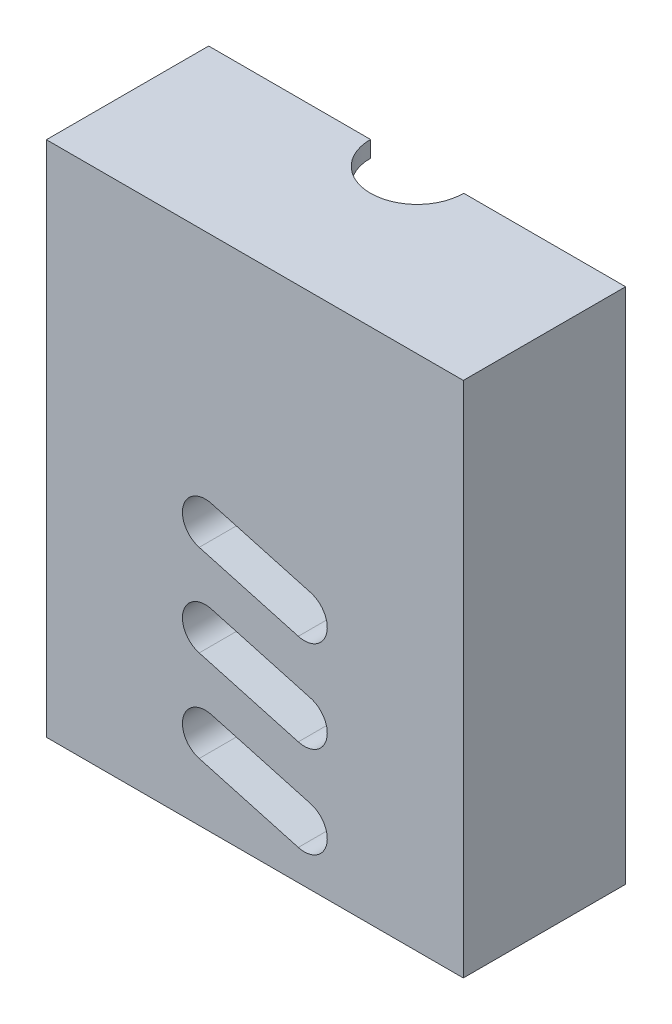
ISO-10303-21;
HEADER;
FILE_DESCRIPTION(('STEP AP214'),'2;1');
FILE_NAME('part.step','',(''),(''),'','','');
FILE_SCHEMA(('AUTOMOTIVE_DESIGN { 1 0 10303 214 1 1 1 1 }'));
ENDSEC;
DATA;
#1=APPLICATION_CONTEXT('core data for automotive mechanical design processes');
#2=APPLICATION_PROTOCOL_DEFINITION('international standard','automotive_design',2000,#1);
#3=PRODUCT_CONTEXT('',#1,'mechanical');
#4=PRODUCT('Part','Part','',(#3));
#5=PRODUCT_RELATED_PRODUCT_CATEGORY('part','',(#4));
#6=PRODUCT_DEFINITION_FORMATION('','',#4);
#7=PRODUCT_DEFINITION_CONTEXT('part definition',#1,'design');
#8=PRODUCT_DEFINITION('design','',#6,#7);
#9=PRODUCT_DEFINITION_SHAPE('','',#8);
#10=(LENGTH_UNIT() NAMED_UNIT(*) SI_UNIT(.MILLI.,.METRE.));
#11=(NAMED_UNIT(*) PLANE_ANGLE_UNIT() SI_UNIT($,.RADIAN.));
#12=(NAMED_UNIT(*) SI_UNIT($,.STERADIAN.) SOLID_ANGLE_UNIT());
#13=UNCERTAINTY_MEASURE_WITH_UNIT(LENGTH_MEASURE(1.E-05),#10,'distance_accuracy_value','');
#14=(GEOMETRIC_REPRESENTATION_CONTEXT(3) GLOBAL_UNCERTAINTY_ASSIGNED_CONTEXT((#13)) GLOBAL_UNIT_ASSIGNED_CONTEXT((#10,
#11,#12)) REPRESENTATION_CONTEXT('',''));
#15=CARTESIAN_POINT('',(0.,0.,0.));
#16=DIRECTION('',(0.,0.,1.));
#17=DIRECTION('',(1.,0.,0.));
#18=AXIS2_PLACEMENT_3D('',#15,#16,#17);
#19=CARTESIAN_POINT('',(0.,0.,7.1));
#20=DIRECTION('',(0.,0.,-1.));
#21=DIRECTION('',(-1.,0.,0.));
#22=AXIS2_PLACEMENT_3D('',#19,#20,#21);
#23=PLANE('',#22);
#24=DIRECTION('',(-0.963668699652356,0.267100425515082,0.));
#25=VECTOR('',#24,1.);
#26=CARTESIAN_POINT('',(2.43535499973288,6.22502443476316,7.1));
#27=LINE('',#26,#25);
#28=CARTESIAN_POINT('',(2.43535499973288,6.22502443476316,7.1));
#29=VERTEX_POINT('',#28);
#30=CARTESIAN_POINT('',(-1.90115414870272,7.42697634958102,7.1));
#31=VERTEX_POINT('',#30);
#32=EDGE_CURVE('E289',#29,#31,#27,.T.);
#33=ORIENTED_EDGE('',*,*,#32,.F.);
#34=CARTESIAN_POINT('',(2.1682545742178,5.2613557351108,7.1));
#35=DIRECTION('',(0.,0.,-1.));
#36=DIRECTION('',(-1.,0.,0.));
#37=AXIS2_PLACEMENT_3D('',#34,#35,#36);
#38=CIRCLE('',#37,0.999999999999999);
#39=CARTESIAN_POINT('',(1.90115414870272,4.29768703545845,7.1));
#40=VERTEX_POINT('',#39);
#41=EDGE_CURVE('E292',#40,#29,#38,.F.);
#42=ORIENTED_EDGE('',*,*,#41,.F.);
#43=DIRECTION('',(0.963668699652356,-0.267100425515082,0.));
#44=VECTOR('',#43,1.);
#45=CARTESIAN_POINT('',(1.90115414870272,4.29768703545845,7.1));
#46=LINE('',#45,#44);
#47=CARTESIAN_POINT('',(-2.43535499973288,5.49963895027632,7.1));
#48=VERTEX_POINT('',#47);
#49=EDGE_CURVE('E294',#48,#40,#46,.T.);
#50=ORIENTED_EDGE('',*,*,#49,.F.);
#51=CARTESIAN_POINT('',(-2.1682545742178,6.46330764992867,7.1));
#52=DIRECTION('',(0.,0.,-1.));
#53=DIRECTION('',(-1.,0.,0.));
#54=AXIS2_PLACEMENT_3D('',#51,#52,#53);
#55=CIRCLE('',#54,0.999999999999999);
#56=EDGE_CURVE('E296',#31,#48,#55,.F.);
#57=ORIENTED_EDGE('',*,*,#56,.F.);
#58=EDGE_LOOP('',(#33,#42,#50,#57));
#59=FACE_BOUND('',#58,.T.);
#60=DIRECTION('',(-0.963668699652356,0.267100425515082,0.));
#61=VECTOR('',#60,1.);
#62=CARTESIAN_POINT('',(2.43535499973288,10.2250244347632,7.1));
#63=LINE('',#62,#61);
#64=CARTESIAN_POINT('',(2.43535499973288,10.2250244347632,7.1));
#65=VERTEX_POINT('',#64);
#66=CARTESIAN_POINT('',(-1.90115414870272,11.426976349581,7.1));
#67=VERTEX_POINT('',#66);
#68=EDGE_CURVE('E280',#65,#67,#63,.T.);
#69=ORIENTED_EDGE('',*,*,#68,.F.);
#70=CARTESIAN_POINT('',(2.1682545742178,9.2613557351108,7.1));
#71=DIRECTION('',(0.,0.,-1.));
#72=DIRECTION('',(-1.,0.,0.));
#73=AXIS2_PLACEMENT_3D('',#70,#71,#72);
#74=CIRCLE('',#73,0.999999999999999);
#75=CARTESIAN_POINT('',(1.90115414870272,8.29768703545845,7.1));
#76=VERTEX_POINT('',#75);
#77=EDGE_CURVE('E283',#76,#65,#74,.F.);
#78=ORIENTED_EDGE('',*,*,#77,.F.);
#79=DIRECTION('',(0.963668699652356,-0.267100425515082,0.));
#80=VECTOR('',#79,1.);
#81=CARTESIAN_POINT('',(1.90115414870272,8.29768703545845,7.1));
#82=LINE('',#81,#80);
#83=CARTESIAN_POINT('',(-2.43535499973288,9.49963895027632,7.1));
#84=VERTEX_POINT('',#83);
#85=EDGE_CURVE('E285',#84,#76,#82,.T.);
#86=ORIENTED_EDGE('',*,*,#85,.F.);
#87=CARTESIAN_POINT('',(-2.1682545742178,10.4633076499287,7.1));
#88=DIRECTION('',(0.,0.,-1.));
#89=DIRECTION('',(-1.,0.,0.));
#90=AXIS2_PLACEMENT_3D('',#87,#88,#89);
#91=CIRCLE('',#90,0.999999999999999);
#92=EDGE_CURVE('E287',#67,#84,#91,.F.);
#93=ORIENTED_EDGE('',*,*,#92,.F.);
#94=EDGE_LOOP('',(#69,#78,#86,#93));
#95=FACE_BOUND('',#94,.T.);
#96=DIRECTION('',(-0.963668699652356,0.267100425515082,0.));
#97=VECTOR('',#96,1.);
#98=CARTESIAN_POINT('',(2.43535499973288,14.2250244347632,7.1));
#99=LINE('',#98,#97);
#100=CARTESIAN_POINT('',(2.43535499973288,14.2250244347632,7.1));
#101=VERTEX_POINT('',#100);
#102=CARTESIAN_POINT('',(-1.90115414870272,15.426976349581,7.1));
#103=VERTEX_POINT('',#102);
#104=EDGE_CURVE('E270',#101,#103,#99,.T.);
#105=ORIENTED_EDGE('',*,*,#104,.F.);
#106=CARTESIAN_POINT('',(2.1682545742178,13.2613557351108,7.1));
#107=DIRECTION('',(0.,0.,-1.));
#108=DIRECTION('',(-1.,0.,0.));
#109=AXIS2_PLACEMENT_3D('',#106,#107,#108);
#110=CIRCLE('',#109,0.999999999999999);
#111=CARTESIAN_POINT('',(1.90115414870272,12.2976870354584,7.1));
#112=VERTEX_POINT('',#111);
#113=EDGE_CURVE('E273',#112,#101,#110,.F.);
#114=ORIENTED_EDGE('',*,*,#113,.F.);
#115=DIRECTION('',(0.963668699652356,-0.267100425515082,0.));
#116=VECTOR('',#115,1.);
#117=CARTESIAN_POINT('',(1.90115414870272,12.2976870354584,7.1));
#118=LINE('',#117,#116);
#119=CARTESIAN_POINT('',(-2.43535499973288,13.4996389502763,7.1));
#120=VERTEX_POINT('',#119);
#121=EDGE_CURVE('E276',#120,#112,#118,.T.);
#122=ORIENTED_EDGE('',*,*,#121,.F.);
#123=CARTESIAN_POINT('',(-2.1682545742178,14.4633076499287,7.1));
#124=DIRECTION('',(0.,0.,-1.));
#125=DIRECTION('',(-1.,0.,0.));
#126=AXIS2_PLACEMENT_3D('',#123,#124,#125);
#127=CIRCLE('',#126,0.999999999999999);
#128=EDGE_CURVE('E278',#103,#120,#127,.F.);
#129=ORIENTED_EDGE('',*,*,#128,.F.);
#130=EDGE_LOOP('',(#105,#114,#122,#129));
#131=FACE_BOUND('',#130,.T.);
#132=DIRECTION('',(0.,-1.,0.));
#133=VECTOR('',#132,1.);
#134=CARTESIAN_POINT('',(9.1200017949237,0.,7.1));
#135=LINE('',#134,#133);
#136=CARTESIAN_POINT('',(9.12000179492368,25.602,7.09999999999987));
#137=VERTEX_POINT('',#136);
#138=CARTESIAN_POINT('',(9.1200017949237,2.96,7.09999999999987));
#139=VERTEX_POINT('',#138);
#140=EDGE_CURVE('E298',#137,#139,#135,.T.);
#141=ORIENTED_EDGE('',*,*,#140,.F.);
#142=DIRECTION('',(-1.,0.,0.));
#143=VECTOR('',#142,1.);
#144=CARTESIAN_POINT('',(-5.12000000000054,25.602,7.1));
#145=LINE('',#144,#143);
#146=CARTESIAN_POINT('',(-9.12000179492367,25.602,7.09999999999987));
#147=VERTEX_POINT('',#146);
#148=EDGE_CURVE('E12',#137,#147,#145,.T.);
#149=ORIENTED_EDGE('',*,*,#148,.T.);
#150=DIRECTION('',(0.,1.,0.));
#151=VECTOR('',#150,1.);
#152=CARTESIAN_POINT('',(-9.1200017949237,0.,7.1));
#153=LINE('',#152,#151);
#154=CARTESIAN_POINT('',(-9.1200017949237,2.96,7.09999999999987));
#155=VERTEX_POINT('',#154);
#156=EDGE_CURVE('E59',#155,#147,#153,.T.);
#157=ORIENTED_EDGE('',*,*,#156,.F.);
#158=DIRECTION('',(-1.,0.,0.));
#159=VECTOR('',#158,1.);
#160=CARTESIAN_POINT('',(0.,2.96,7.1));
#161=LINE('',#160,#159);
#162=EDGE_CURVE('E54',#139,#155,#161,.T.);
#163=ORIENTED_EDGE('',*,*,#162,.F.);
#164=EDGE_LOOP('',(#141,#149,#157,#163));
#165=FACE_BOUND('',#164,.T.);
#166=ADVANCED_FACE('F51',(#59,#95,#131,#165),#23,.F.);
#167=CARTESIAN_POINT('',(-6.1199989685509,-0.224912574405044,-4.08000154717327));
#168=DIRECTION('',(-0.999999999999968,0.,-2.52806110030354E-07));
#169=DIRECTION('',(2.52806110030354E-07,0.,-0.999999999999968));
#170=AXIS2_PLACEMENT_3D('',#167,#168,#169);
#171=PLANE('',#170);
#172=DIRECTION('',(-2.52806110030354E-07,0.,0.999999999999968));
#173=VECTOR('',#172,1.);
#174=CARTESIAN_POINT('',(-6.11999896855089,15.708,-4.08000154717327));
#175=LINE('',#174,#173);
#176=CARTESIAN_POINT('',(-6.11999999999982,15.708,-1.52666162491285E-06));
#177=VERTEX_POINT('',#176);
#178=CARTESIAN_POINT('',(-6.12000103144874,15.708,4.07999845282648));
#179=VERTEX_POINT('',#178);
#180=EDGE_CURVE('E391',#177,#179,#175,.T.);
#181=ORIENTED_EDGE('',*,*,#180,.F.);
#182=DIRECTION('',(0.,1.,0.));
#183=VECTOR('',#182,1.);
#184=CARTESIAN_POINT('',(-6.12000000000022,0.,0.));
#185=LINE('',#184,#183);
#186=CARTESIAN_POINT('',(-6.1200000000002,24.888,0.));
#187=VERTEX_POINT('',#186);
#188=EDGE_CURVE('E379',#177,#187,#185,.T.);
#189=ORIENTED_EDGE('',*,*,#188,.T.);
#190=DIRECTION('',(2.52806110030354E-07,0.,-0.999999999999968));
#191=VECTOR('',#190,1.);
#192=CARTESIAN_POINT('',(-6.11999896855088,24.888,-4.08000154717327));
#193=LINE('',#192,#191);
#194=CARTESIAN_POINT('',(-6.12000103144874,24.888,4.07999845282648));
#195=VERTEX_POINT('',#194);
#196=EDGE_CURVE('E396',#195,#187,#193,.T.);
#197=ORIENTED_EDGE('',*,*,#196,.F.);
#198=DIRECTION('',(0.,1.,0.));
#199=VECTOR('',#198,1.);
#200=CARTESIAN_POINT('',(-6.12000103144876,-0.224912574405048,4.07999845282648));
#201=LINE('',#200,#199);
#202=EDGE_CURVE('E395',#179,#195,#201,.T.);
#203=ORIENTED_EDGE('',*,*,#202,.F.);
#204=EDGE_LOOP('',(#181,#189,#197,#203));
#205=FACE_BOUND('',#204,.T.);
#206=ADVANCED_FACE('F511',(#205),#171,.F.);
#207=CARTESIAN_POINT('',(6.1199989685509,-0.224912574405044,-4.08000154717327));
#208=DIRECTION('',(0.999999999999968,0.,-2.52806110030354E-07));
#209=DIRECTION('',(-2.52806110030354E-07,0.,-0.999999999999968));
#210=AXIS2_PLACEMENT_3D('',#207,#208,#209);
#211=PLANE('',#210);
#212=DIRECTION('',(2.52806110030354E-07,0.,0.999999999999968));
#213=VECTOR('',#212,1.);
#214=CARTESIAN_POINT('',(6.11999896855089,15.708,-4.08000154717327));
#215=LINE('',#214,#213);
#216=CARTESIAN_POINT('',(6.11999999999982,15.708,-1.52666162491285E-06));
#217=VERTEX_POINT('',#216);
#218=CARTESIAN_POINT('',(6.12000103144874,15.708,4.07999845282648));
#219=VERTEX_POINT('',#218);
#220=EDGE_CURVE('E348',#217,#219,#215,.T.);
#221=ORIENTED_EDGE('',*,*,#220,.T.);
#222=DIRECTION('',(0.,1.,0.));
#223=VECTOR('',#222,1.);
#224=CARTESIAN_POINT('',(6.12000103144876,-0.224912574405048,4.07999845282648));
#225=LINE('',#224,#223);
#226=CARTESIAN_POINT('',(6.12000103144874,24.888,4.07999845282648));
#227=VERTEX_POINT('',#226);
#228=EDGE_CURVE('E359',#219,#227,#225,.T.);
#229=ORIENTED_EDGE('',*,*,#228,.T.);
#230=DIRECTION('',(-2.52806110030354E-07,0.,-0.999999999999968));
#231=VECTOR('',#230,1.);
#232=CARTESIAN_POINT('',(6.11999896855088,24.888,-4.08000154717327));
#233=LINE('',#232,#231);
#234=CARTESIAN_POINT('',(6.1200000000002,24.888,0.));
#235=VERTEX_POINT('',#234);
#236=EDGE_CURVE('E360',#227,#235,#233,.T.);
#237=ORIENTED_EDGE('',*,*,#236,.T.);
#238=DIRECTION('',(0.,1.,0.));
#239=VECTOR('',#238,1.);
#240=CARTESIAN_POINT('',(6.12000000000022,0.,0.));
#241=LINE('',#240,#239);
#242=EDGE_CURVE('E318',#217,#235,#241,.T.);
#243=ORIENTED_EDGE('',*,*,#242,.F.);
#244=EDGE_LOOP('',(#221,#229,#237,#243));
#245=FACE_BOUND('',#244,.T.);
#246=ADVANCED_FACE('F518',(#245),#211,.F.);
#247=CARTESIAN_POINT('',(0.,15.708,0.));
#248=DIRECTION('',(0.,1.,0.));
#249=DIRECTION('',(1.,0.,0.));
#250=AXIS2_PLACEMENT_3D('',#247,#248,#249);
#251=PLANE('',#250);
#252=CARTESIAN_POINT('',(0.0811363636363651,15.708,0.));
#253=DIRECTION('',(0.,1.,0.));
#254=DIRECTION('',(0.,0.,1.));
#255=AXIS2_PLACEMENT_3D('',#252,#253,#254);
#256=CIRCLE('',#255,6.03886363636364);
#257=CARTESIAN_POINT('',(3.31499999999979,15.708,5.09999916194791));
#258=VERTEX_POINT('',#257);
#259=EDGE_CURVE('E347',#217,#258,#256,.F.);
#260=ORIENTED_EDGE('',*,*,#259,.T.);
#261=DIRECTION('',(-0.999999999999968,0.,2.52806109986986E-07));
#262=VECTOR('',#261,1.);
#263=CARTESIAN_POINT('',(-5.09999871068865,15.708,5.100001289311));
#264=LINE('',#263,#262);
#265=CARTESIAN_POINT('',(5.10000128931102,15.708,5.09999871068868));
#266=VERTEX_POINT('',#265);
#267=EDGE_CURVE('E345',#266,#258,#264,.T.);
#268=ORIENTED_EDGE('',*,*,#267,.F.);
#269=CARTESIAN_POINT('',(5.10000103144877,15.708,4.0799987106887));
#270=DIRECTION('',(0.,1.,0.));
#271=DIRECTION('',(0.,0.,1.));
#272=AXIS2_PLACEMENT_3D('',#269,#270,#271);
#273=CIRCLE('',#272,1.02000000000001);
#274=EDGE_CURVE('E352',#219,#266,#273,.F.);
#275=ORIENTED_EDGE('',*,*,#274,.F.);
#276=ORIENTED_EDGE('',*,*,#220,.F.);
#277=EDGE_LOOP('',(#260,#268,#275,#276));
#278=FACE_BOUND('',#277,.T.);
#279=ADVANCED_FACE('F552',(#278),#251,.T.);
#280=CARTESIAN_POINT('',(5.10000103144878,-0.224912574405048,4.0799987106887));
#281=DIRECTION('',(0.,1.,0.));
#282=DIRECTION('',(-1.,0.,0.));
#283=AXIS2_PLACEMENT_3D('',#280,#281,#282);
#284=CYLINDRICAL_SURFACE('',#283,1.02000000000001);
#285=ORIENTED_EDGE('',*,*,#228,.F.);
#286=ORIENTED_EDGE('',*,*,#274,.T.);
#287=DIRECTION('',(0.,1.,0.));
#288=VECTOR('',#287,1.);
#289=CARTESIAN_POINT('',(5.10000128931102,-0.224912574405048,5.09999871068868));
#290=LINE('',#289,#288);
#291=CARTESIAN_POINT('',(5.100001289311,24.888,5.09999871068868));
#292=VERTEX_POINT('',#291);
#293=EDGE_CURVE('E355',#266,#292,#290,.T.);
#294=ORIENTED_EDGE('',*,*,#293,.T.);
#295=CARTESIAN_POINT('',(5.10000103144876,24.888,4.0799987106887));
#296=DIRECTION('',(0.,1.,0.));
#297=DIRECTION('',(1.,0.,0.));
#298=AXIS2_PLACEMENT_3D('',#295,#296,#297);
#299=CIRCLE('',#298,1.02000000000001);
#300=EDGE_CURVE('E363',#292,#227,#299,.T.);
#301=ORIENTED_EDGE('',*,*,#300,.T.);
#302=EDGE_LOOP('',(#285,#286,#294,#301));
#303=FACE_BOUND('',#302,.T.);
#304=ADVANCED_FACE('F554',(#303),#284,.F.);
#305=CARTESIAN_POINT('',(-5.10000103144876,24.888,-4.07999871068871));
#306=DIRECTION('',(0.,-1.,0.));
#307=DIRECTION('',(1.,0.,0.));
#308=AXIS2_PLACEMENT_3D('',#305,#306,#307);
#309=PLANE('',#308);
#310=DIRECTION('',(0.999999999999968,0.,-2.52806109986986E-07));
#311=VECTOR('',#310,1.);
#312=CARTESIAN_POINT('',(-5.09999871068868,24.888,5.100001289311));
#313=LINE('',#312,#311);
#314=CARTESIAN_POINT('',(0.,24.888,5.10000000000016));
#315=VERTEX_POINT('',#314);
#316=EDGE_CURVE('E366',#315,#292,#313,.T.);
#317=ORIENTED_EDGE('',*,*,#316,.F.);
#318=DIRECTION('',(-0.999999999999968,0.,-2.52806109986986E-07));
#319=VECTOR('',#318,1.);
#320=CARTESIAN_POINT('',(5.09999871068868,24.888,5.100001289311));
#321=LINE('',#320,#319);
#322=CARTESIAN_POINT('',(-5.100001289311,24.888,5.09999871068868));
#323=VERTEX_POINT('',#322);
#324=EDGE_CURVE('E405',#315,#323,#321,.T.);
#325=ORIENTED_EDGE('',*,*,#324,.T.);
#326=CARTESIAN_POINT('',(-5.10000103144876,24.888,4.0799987106887));
#327=DIRECTION('',(0.,-1.,0.));
#328=DIRECTION('',(-1.,0.,0.));
#329=AXIS2_PLACEMENT_3D('',#326,#327,#328);
#330=CIRCLE('',#329,1.02000000000001);
#331=EDGE_CURVE('E402',#323,#195,#330,.T.);
#332=ORIENTED_EDGE('',*,*,#331,.T.);
#333=ORIENTED_EDGE('',*,*,#196,.T.);
#334=DIRECTION('',(-1.,0.,0.));
#335=VECTOR('',#334,1.);
#336=CARTESIAN_POINT('',(0.,24.888,0.));
#337=LINE('',#336,#335);
#338=CARTESIAN_POINT('',(-2.04,24.888,0.));
#339=VERTEX_POINT('',#338);
#340=EDGE_CURVE('E262',#339,#187,#337,.T.);
#341=ORIENTED_EDGE('',*,*,#340,.F.);
#342=CARTESIAN_POINT('',(0.,24.888,0.));
#343=DIRECTION('',(0.,-1.,0.));
#344=DIRECTION('',(0.999999999999968,0.,-2.5280611E-07));
#345=AXIS2_PLACEMENT_3D('',#342,#343,#344);
#346=CIRCLE('',#345,2.04);
#347=CARTESIAN_POINT('',(2.04,24.888,0.));
#348=VERTEX_POINT('',#347);
#349=EDGE_CURVE('E374',#348,#339,#346,.T.);
#350=ORIENTED_EDGE('',*,*,#349,.F.);
#351=DIRECTION('',(1.,0.,0.));
#352=VECTOR('',#351,1.);
#353=CARTESIAN_POINT('',(0.,24.888,0.));
#354=LINE('',#353,#352);
#355=EDGE_CURVE('E314',#348,#235,#354,.T.);
#356=ORIENTED_EDGE('',*,*,#355,.T.);
#357=ORIENTED_EDGE('',*,*,#236,.F.);
#358=ORIENTED_EDGE('',*,*,#300,.F.);
#359=EDGE_LOOP('',(#317,#325,#332,#333,#341,#350,#356,#357,#358));
#360=FACE_BOUND('',#359,.T.);
#361=ADVANCED_FACE('F555',(#360),#309,.T.);
#362=CARTESIAN_POINT('',(-5.10000103144878,-0.224912574405048,4.0799987106887));
#363=DIRECTION('',(0.,1.,0.));
#364=DIRECTION('',(1.,0.,0.));
#365=AXIS2_PLACEMENT_3D('',#362,#363,#364);
#366=CYLINDRICAL_SURFACE('',#365,1.02000000000001);
#367=ORIENTED_EDGE('',*,*,#202,.T.);
#368=ORIENTED_EDGE('',*,*,#331,.F.);
#369=DIRECTION('',(0.,1.,0.));
#370=VECTOR('',#369,1.);
#371=CARTESIAN_POINT('',(-5.10000128931102,-0.224912574405048,5.09999871068868));
#372=LINE('',#371,#370);
#373=CARTESIAN_POINT('',(-5.10000128931102,15.708,5.09999871068868));
#374=VERTEX_POINT('',#373);
#375=EDGE_CURVE('E392',#374,#323,#372,.T.);
#376=ORIENTED_EDGE('',*,*,#375,.F.);
#377=CARTESIAN_POINT('',(-5.10000103144877,15.708,4.0799987106887));
#378=DIRECTION('',(0.,-1.,0.));
#379=DIRECTION('',(0.,0.,1.));
#380=AXIS2_PLACEMENT_3D('',#377,#378,#379);
#381=CIRCLE('',#380,1.02000000000001);
#382=EDGE_CURVE('E410',#179,#374,#381,.F.);
#383=ORIENTED_EDGE('',*,*,#382,.F.);
#384=EDGE_LOOP('',(#367,#368,#376,#383));
#385=FACE_BOUND('',#384,.T.);
#386=ADVANCED_FACE('F558',(#385),#366,.F.);
#387=CARTESIAN_POINT('',(0.,15.708,0.));
#388=DIRECTION('',(0.,1.,0.));
#389=DIRECTION('',(-1.,0.,0.));
#390=AXIS2_PLACEMENT_3D('',#387,#388,#389);
#391=PLANE('',#390);
#392=CARTESIAN_POINT('',(-0.0811363636363651,15.708,0.));
#393=DIRECTION('',(0.,-1.,0.));
#394=DIRECTION('',(0.,0.,1.));
#395=AXIS2_PLACEMENT_3D('',#392,#393,#394);
#396=CIRCLE('',#395,6.03886363636364);
#397=CARTESIAN_POINT('',(-3.31499999999979,15.708,5.09999916194791));
#398=VERTEX_POINT('',#397);
#399=EDGE_CURVE('E386',#177,#398,#396,.F.);
#400=ORIENTED_EDGE('',*,*,#399,.F.);
#401=ORIENTED_EDGE('',*,*,#180,.T.);
#402=ORIENTED_EDGE('',*,*,#382,.T.);
#403=DIRECTION('',(0.999999999999968,0.,2.52806109986986E-07));
#404=VECTOR('',#403,1.);
#405=CARTESIAN_POINT('',(5.09999871068865,15.708,5.100001289311));
#406=LINE('',#405,#404);
#407=EDGE_CURVE('E399',#374,#398,#406,.T.);
#408=ORIENTED_EDGE('',*,*,#407,.T.);
#409=EDGE_LOOP('',(#400,#401,#402,#408));
#410=FACE_BOUND('',#409,.T.);
#411=ADVANCED_FACE('F566',(#410),#391,.T.);
#412=CARTESIAN_POINT('',(0.0811363636363651,31.6409093388496,0.));
#413=DIRECTION('',(0.,-1.,0.));
#414=DIRECTION('',(0.,0.,-1.));
#415=AXIS2_PLACEMENT_3D('',#412,#413,#414);
#416=CYLINDRICAL_SURFACE('',#415,6.03886363636364);
#417=DIRECTION('',(0.,-1.,0.));
#418=VECTOR('',#417,1.);
#419=CARTESIAN_POINT('',(6.12,31.6409093388496,0.));
#420=LINE('',#419,#418);
#421=CARTESIAN_POINT('',(6.12,2.96,0.));
#422=VERTEX_POINT('',#421);
#423=EDGE_CURVE('E326',#422,#217,#420,.F.);
#424=ORIENTED_EDGE('',*,*,#423,.F.);
#425=CARTESIAN_POINT('',(0.0811363636363651,2.96,0.));
#426=DIRECTION('',(0.,1.,0.));
#427=DIRECTION('',(0.,0.,1.));
#428=AXIS2_PLACEMENT_3D('',#425,#426,#427);
#429=CIRCLE('',#428,6.03886363636364);
#430=CARTESIAN_POINT('',(3.315,2.96,5.1));
#431=VERTEX_POINT('',#430);
#432=EDGE_CURVE('E317',#422,#431,#429,.F.);
#433=ORIENTED_EDGE('',*,*,#432,.T.);
#434=DIRECTION('',(0.,-1.,0.));
#435=VECTOR('',#434,1.);
#436=CARTESIAN_POINT('',(3.315,31.6409093388496,5.1));
#437=LINE('',#436,#435);
#438=EDGE_CURVE('E330',#258,#431,#437,.T.);
#439=ORIENTED_EDGE('',*,*,#438,.F.);
#440=ORIENTED_EDGE('',*,*,#259,.F.);
#441=EDGE_LOOP('',(#424,#433,#439,#440));
#442=FACE_BOUND('',#441,.T.);
#443=ADVANCED_FACE('F337',(#442),#416,.F.);
#444=CARTESIAN_POINT('',(1.90115414870272,4.29768703545845,10.1000000000003));
#445=DIRECTION('',(-0.267100425515082,-0.963668699652356,0.));
#446=DIRECTION('',(0.963668699652356,-0.267100425515082,0.));
#447=AXIS2_PLACEMENT_3D('',#444,#445,#446);
#448=PLANE('',#447);
#449=DIRECTION('',(0.,0.,-1.));
#450=VECTOR('',#449,1.);
#451=CARTESIAN_POINT('',(-2.43535499973288,5.49963895027632,10.1000000000003));
#452=LINE('',#451,#450);
#453=CARTESIAN_POINT('',(-2.43535499973288,5.49963895027632,5.1));
#454=VERTEX_POINT('',#453);
#455=EDGE_CURVE('E437',#48,#454,#452,.T.);
#456=ORIENTED_EDGE('',*,*,#455,.F.);
#457=ORIENTED_EDGE('',*,*,#49,.T.);
#458=DIRECTION('',(0.,0.,-1.));
#459=VECTOR('',#458,1.);
#460=CARTESIAN_POINT('',(1.90115414870272,4.29768703545845,10.1000000000003));
#461=LINE('',#460,#459);
#462=CARTESIAN_POINT('',(1.90115414870272,4.29768703545844,5.1));
#463=VERTEX_POINT('',#462);
#464=EDGE_CURVE('E432',#40,#463,#461,.T.);
#465=ORIENTED_EDGE('',*,*,#464,.T.);
#466=DIRECTION('',(-0.963668699652356,0.267100425515082,0.));
#467=VECTOR('',#466,1.);
#468=CARTESIAN_POINT('',(1.90115414870272,4.29768703545845,5.1));
#469=LINE('',#468,#467);
#470=EDGE_CURVE('E423',#463,#454,#469,.T.);
#471=ORIENTED_EDGE('',*,*,#470,.T.);
#472=EDGE_LOOP('',(#456,#457,#465,#471));
#473=FACE_BOUND('',#472,.T.);
#474=ADVANCED_FACE('F565',(#473),#448,.F.);
#475=CARTESIAN_POINT('',(1.90115414870272,8.29768703545845,10.1000000000003));
#476=DIRECTION('',(-0.267100425515082,-0.963668699652356,0.));
#477=DIRECTION('',(0.963668699652356,-0.267100425515082,0.));
#478=AXIS2_PLACEMENT_3D('',#475,#476,#477);
#479=PLANE('',#478);
#480=DIRECTION('',(0.,0.,-1.));
#481=VECTOR('',#480,1.);
#482=CARTESIAN_POINT('',(-2.43535499973288,9.49963895027632,10.1000000000003));
#483=LINE('',#482,#481);
#484=CARTESIAN_POINT('',(-2.43535499973288,9.49963895027632,5.1));
#485=VERTEX_POINT('',#484);
#486=EDGE_CURVE('E457',#84,#485,#483,.T.);
#487=ORIENTED_EDGE('',*,*,#486,.F.);
#488=ORIENTED_EDGE('',*,*,#85,.T.);
#489=DIRECTION('',(0.,0.,-1.));
#490=VECTOR('',#489,1.);
#491=CARTESIAN_POINT('',(1.90115414870272,8.29768703545845,10.1000000000003));
#492=LINE('',#491,#490);
#493=CARTESIAN_POINT('',(1.90115414870272,8.29768703545844,5.1));
#494=VERTEX_POINT('',#493);
#495=EDGE_CURVE('E453',#76,#494,#492,.T.);
#496=ORIENTED_EDGE('',*,*,#495,.T.);
#497=DIRECTION('',(-0.963668699652356,0.267100425515082,0.));
#498=VECTOR('',#497,1.);
#499=CARTESIAN_POINT('',(1.90115414870272,8.29768703545845,5.1));
#500=LINE('',#499,#498);
#501=EDGE_CURVE('E444',#494,#485,#500,.T.);
#502=ORIENTED_EDGE('',*,*,#501,.T.);
#503=EDGE_LOOP('',(#487,#488,#496,#502));
#504=FACE_BOUND('',#503,.T.);
#505=ADVANCED_FACE('F569',(#504),#479,.F.);
#506=CARTESIAN_POINT('',(1.90115414870272,12.2976870354584,10.1000000000003));
#507=DIRECTION('',(-0.267100425515082,-0.963668699652356,0.));
#508=DIRECTION('',(0.963668699652356,-0.267100425515082,0.));
#509=AXIS2_PLACEMENT_3D('',#506,#507,#508);
#510=PLANE('',#509);
#511=DIRECTION('',(0.,0.,-1.));
#512=VECTOR('',#511,1.);
#513=CARTESIAN_POINT('',(-2.43535499973288,13.4996389502763,10.1000000000003));
#514=LINE('',#513,#512);
#515=CARTESIAN_POINT('',(-2.43535499973288,13.4996389502763,5.1));
#516=VERTEX_POINT('',#515);
#517=EDGE_CURVE('E462',#120,#516,#514,.T.);
#518=ORIENTED_EDGE('',*,*,#517,.F.);
#519=ORIENTED_EDGE('',*,*,#121,.T.);
#520=DIRECTION('',(0.,0.,-1.));
#521=VECTOR('',#520,1.);
#522=CARTESIAN_POINT('',(1.90115414870272,12.2976870354584,10.1000000000003));
#523=LINE('',#522,#521);
#524=CARTESIAN_POINT('',(1.90115414870272,12.2976870354584,5.1));
#525=VERTEX_POINT('',#524);
#526=EDGE_CURVE('E460',#112,#525,#523,.T.);
#527=ORIENTED_EDGE('',*,*,#526,.T.);
#528=DIRECTION('',(-0.963668699652356,0.267100425515082,0.));
#529=VECTOR('',#528,1.);
#530=CARTESIAN_POINT('',(1.90115414870272,12.2976870354584,5.1));
#531=LINE('',#530,#529);
#532=EDGE_CURVE('E473',#525,#516,#531,.T.);
#533=ORIENTED_EDGE('',*,*,#532,.T.);
#534=EDGE_LOOP('',(#518,#519,#527,#533));
#535=FACE_BOUND('',#534,.T.);
#536=ADVANCED_FACE('F489',(#535),#510,.F.);
#537=CARTESIAN_POINT('',(3.315,31.6409093388496,5.1));
#538=DIRECTION('',(0.,0.,1.));
#539=DIRECTION('',(1.,0.,0.));
#540=AXIS2_PLACEMENT_3D('',#537,#538,#539);
#541=PLANE('',#540);
#542=ORIENTED_EDGE('',*,*,#532,.F.);
#543=CARTESIAN_POINT('',(2.1682545742178,13.2613557351108,5.1));
#544=DIRECTION('',(0.,0.,-1.));
#545=DIRECTION('',(-1.,0.,0.));
#546=AXIS2_PLACEMENT_3D('',#543,#544,#545);
#547=CIRCLE('',#546,0.999999999999999);
#548=CARTESIAN_POINT('',(2.43535499973288,14.2250244347632,5.1));
#549=VERTEX_POINT('',#548);
#550=EDGE_CURVE('E443',#549,#525,#547,.T.);
#551=ORIENTED_EDGE('',*,*,#550,.F.);
#552=DIRECTION('',(0.963668699652356,-0.267100425515082,0.));
#553=VECTOR('',#552,1.);
#554=CARTESIAN_POINT('',(2.43535499973288,14.2250244347632,5.1));
#555=LINE('',#554,#553);
#556=CARTESIAN_POINT('',(-1.90115414870272,15.426976349581,5.1));
#557=VERTEX_POINT('',#556);
#558=EDGE_CURVE('E463',#557,#549,#555,.T.);
#559=ORIENTED_EDGE('',*,*,#558,.F.);
#560=CARTESIAN_POINT('',(-2.1682545742178,14.4633076499287,5.1));
#561=DIRECTION('',(0.,0.,-1.));
#562=DIRECTION('',(-1.,0.,0.));
#563=AXIS2_PLACEMENT_3D('',#560,#561,#562);
#564=CIRCLE('',#563,0.999999999999999);
#565=EDGE_CURVE('E470',#516,#557,#564,.T.);
#566=ORIENTED_EDGE('',*,*,#565,.F.);
#567=EDGE_LOOP('',(#542,#551,#559,#566));
#568=FACE_BOUND('',#567,.T.);
#569=ORIENTED_EDGE('',*,*,#501,.F.);
#570=CARTESIAN_POINT('',(2.1682545742178,9.2613557351108,5.1));
#571=DIRECTION('',(0.,0.,-1.));
#572=DIRECTION('',(-1.,0.,0.));
#573=AXIS2_PLACEMENT_3D('',#570,#571,#572);
#574=CIRCLE('',#573,0.999999999999999);
#575=CARTESIAN_POINT('',(2.43535499973288,10.2250244347632,5.1));
#576=VERTEX_POINT('',#575);
#577=EDGE_CURVE('E440',#576,#494,#574,.T.);
#578=ORIENTED_EDGE('',*,*,#577,.F.);
#579=DIRECTION('',(0.963668699652356,-0.267100425515082,0.));
#580=VECTOR('',#579,1.);
#581=CARTESIAN_POINT('',(2.43535499973288,10.2250244347632,5.1));
#582=LINE('',#581,#580);
#583=CARTESIAN_POINT('',(-1.90115414870272,11.426976349581,5.1));
#584=VERTEX_POINT('',#583);
#585=EDGE_CURVE('E450',#584,#576,#582,.T.);
#586=ORIENTED_EDGE('',*,*,#585,.F.);
#587=CARTESIAN_POINT('',(-2.1682545742178,10.4633076499287,5.1));
#588=DIRECTION('',(0.,0.,-1.));
#589=DIRECTION('',(-1.,0.,0.));
#590=AXIS2_PLACEMENT_3D('',#587,#588,#589);
#591=CIRCLE('',#590,0.999999999999999);
#592=EDGE_CURVE('E447',#485,#584,#591,.T.);
#593=ORIENTED_EDGE('',*,*,#592,.F.);
#594=EDGE_LOOP('',(#569,#578,#586,#593));
#595=FACE_BOUND('',#594,.T.);
#596=ORIENTED_EDGE('',*,*,#470,.F.);
#597=CARTESIAN_POINT('',(2.1682545742178,5.2613557351108,5.1));
#598=DIRECTION('',(0.,0.,-1.));
#599=DIRECTION('',(-1.,0.,0.));
#600=AXIS2_PLACEMENT_3D('',#597,#598,#599);
#601=CIRCLE('',#600,0.999999999999999);
#602=CARTESIAN_POINT('',(2.43535499973288,6.22502443476316,5.1));
#603=VERTEX_POINT('',#602);
#604=EDGE_CURVE('E419',#603,#463,#601,.T.);
#605=ORIENTED_EDGE('',*,*,#604,.F.);
#606=DIRECTION('',(0.963668699652356,-0.267100425515082,0.));
#607=VECTOR('',#606,1.);
#608=CARTESIAN_POINT('',(2.43535499973288,6.22502443476316,5.1));
#609=LINE('',#608,#607);
#610=CARTESIAN_POINT('',(-1.90115414870272,7.42697634958102,5.1));
#611=VERTEX_POINT('',#610);
#612=EDGE_CURVE('E429',#611,#603,#609,.T.);
#613=ORIENTED_EDGE('',*,*,#612,.F.);
#614=CARTESIAN_POINT('',(-2.1682545742178,6.46330764992867,5.1));
#615=DIRECTION('',(0.,0.,-1.));
#616=DIRECTION('',(-1.,0.,0.));
#617=AXIS2_PLACEMENT_3D('',#614,#615,#616);
#618=CIRCLE('',#617,0.999999999999999);
#619=EDGE_CURVE('E426',#454,#611,#618,.T.);
#620=ORIENTED_EDGE('',*,*,#619,.F.);
#621=EDGE_LOOP('',(#596,#605,#613,#620));
#622=FACE_BOUND('',#621,.T.);
#623=ORIENTED_EDGE('',*,*,#438,.T.);
#624=DIRECTION('',(-1.,0.,0.));
#625=VECTOR('',#624,1.);
#626=CARTESIAN_POINT('',(3.315,2.96,5.1));
#627=LINE('',#626,#625);
#628=CARTESIAN_POINT('',(-3.315,2.96,5.1));
#629=VERTEX_POINT('',#628);
#630=EDGE_CURVE('E274',#431,#629,#627,.T.);
#631=ORIENTED_EDGE('',*,*,#630,.T.);
#632=DIRECTION('',(0.,-1.,0.));
#633=VECTOR('',#632,1.);
#634=CARTESIAN_POINT('',(-3.315,31.6409093388496,5.1));
#635=LINE('',#634,#633);
#636=EDGE_CURVE('E383',#398,#629,#635,.T.);
#637=ORIENTED_EDGE('',*,*,#636,.F.);
#638=ORIENTED_EDGE('',*,*,#407,.F.);
#639=ORIENTED_EDGE('',*,*,#375,.T.);
#640=ORIENTED_EDGE('',*,*,#324,.F.);
#641=ORIENTED_EDGE('',*,*,#316,.T.);
#642=ORIENTED_EDGE('',*,*,#293,.F.);
#643=ORIENTED_EDGE('',*,*,#267,.T.);
#644=EDGE_LOOP('',(#623,#631,#637,#638,#639,#640,#641,#642,#643));
#645=FACE_BOUND('',#644,.T.);
#646=ADVANCED_FACE('F342',(#568,#595,#622,#645),#541,.F.);
#647=CARTESIAN_POINT('',(-2.1682545742178,14.4633076499287,10.1000000000003));
#648=DIRECTION('',(0.,0.,-1.));
#649=DIRECTION('',(-1.,0.,0.));
#650=AXIS2_PLACEMENT_3D('',#647,#648,#649);
#651=CYLINDRICAL_SURFACE('',#650,0.999999999999999);
#652=DIRECTION('',(0.,0.,-1.));
#653=VECTOR('',#652,1.);
#654=CARTESIAN_POINT('',(-1.90115414870272,15.426976349581,10.1000000000003));
#655=LINE('',#654,#653);
#656=EDGE_CURVE('E465',#103,#557,#655,.T.);
#657=ORIENTED_EDGE('',*,*,#656,.F.);
#658=ORIENTED_EDGE('',*,*,#128,.T.);
#659=ORIENTED_EDGE('',*,*,#517,.T.);
#660=ORIENTED_EDGE('',*,*,#565,.T.);
#661=EDGE_LOOP('',(#657,#658,#659,#660));
#662=FACE_BOUND('',#661,.T.);
#663=ADVANCED_FACE('F498',(#662),#651,.F.);
#664=CARTESIAN_POINT('',(2.1682545742178,13.2613557351108,10.1000000000003));
#665=DIRECTION('',(0.,0.,-1.));
#666=DIRECTION('',(-1.,0.,0.));
#667=AXIS2_PLACEMENT_3D('',#664,#665,#666);
#668=CYLINDRICAL_SURFACE('',#667,0.999999999999999);
#669=ORIENTED_EDGE('',*,*,#526,.F.);
#670=ORIENTED_EDGE('',*,*,#113,.T.);
#671=DIRECTION('',(0.,0.,-1.));
#672=VECTOR('',#671,1.);
#673=CARTESIAN_POINT('',(2.43535499973288,14.2250244347632,10.1000000000003));
#674=LINE('',#673,#672);
#675=EDGE_CURVE('E418',#101,#549,#674,.T.);
#676=ORIENTED_EDGE('',*,*,#675,.T.);
#677=ORIENTED_EDGE('',*,*,#550,.T.);
#678=EDGE_LOOP('',(#669,#670,#676,#677));
#679=FACE_BOUND('',#678,.T.);
#680=ADVANCED_FACE('F481',(#679),#668,.F.);
#681=CARTESIAN_POINT('',(2.43535499973288,14.2250244347632,10.1000000000003));
#682=DIRECTION('',(0.267100425515082,0.963668699652356,0.));
#683=DIRECTION('',(-0.963668699652356,0.267100425515082,0.));
#684=AXIS2_PLACEMENT_3D('',#681,#682,#683);
#685=PLANE('',#684);
#686=ORIENTED_EDGE('',*,*,#675,.F.);
#687=ORIENTED_EDGE('',*,*,#104,.T.);
#688=ORIENTED_EDGE('',*,*,#656,.T.);
#689=ORIENTED_EDGE('',*,*,#558,.T.);
#690=EDGE_LOOP('',(#686,#687,#688,#689));
#691=FACE_BOUND('',#690,.T.);
#692=ADVANCED_FACE('F496',(#691),#685,.F.);
#693=CARTESIAN_POINT('',(-2.1682545742178,10.4633076499287,10.1000000000003));
#694=DIRECTION('',(0.,0.,-1.));
#695=DIRECTION('',(-1.,0.,0.));
#696=AXIS2_PLACEMENT_3D('',#693,#694,#695);
#697=CYLINDRICAL_SURFACE('',#696,0.999999999999999);
#698=DIRECTION('',(0.,0.,-1.));
#699=VECTOR('',#698,1.);
#700=CARTESIAN_POINT('',(-1.90115414870272,11.426976349581,10.1000000000003));
#701=LINE('',#700,#699);
#702=EDGE_CURVE('E455',#67,#584,#701,.T.);
#703=ORIENTED_EDGE('',*,*,#702,.F.);
#704=ORIENTED_EDGE('',*,*,#92,.T.);
#705=ORIENTED_EDGE('',*,*,#486,.T.);
#706=ORIENTED_EDGE('',*,*,#592,.T.);
#707=EDGE_LOOP('',(#703,#704,#705,#706));
#708=FACE_BOUND('',#707,.T.);
#709=ADVANCED_FACE('F599',(#708),#697,.F.);
#710=CARTESIAN_POINT('',(2.1682545742178,9.2613557351108,10.1000000000003));
#711=DIRECTION('',(0.,0.,-1.));
#712=DIRECTION('',(-1.,0.,0.));
#713=AXIS2_PLACEMENT_3D('',#710,#711,#712);
#714=CYLINDRICAL_SURFACE('',#713,0.999999999999999);
#715=ORIENTED_EDGE('',*,*,#495,.F.);
#716=ORIENTED_EDGE('',*,*,#77,.T.);
#717=DIRECTION('',(0.,0.,-1.));
#718=VECTOR('',#717,1.);
#719=CARTESIAN_POINT('',(2.43535499973288,10.2250244347632,10.1000000000003));
#720=LINE('',#719,#718);
#721=EDGE_CURVE('E422',#65,#576,#720,.T.);
#722=ORIENTED_EDGE('',*,*,#721,.T.);
#723=ORIENTED_EDGE('',*,*,#577,.T.);
#724=EDGE_LOOP('',(#715,#716,#722,#723));
#725=FACE_BOUND('',#724,.T.);
#726=ADVANCED_FACE('F597',(#725),#714,.F.);
#727=CARTESIAN_POINT('',(2.43535499973288,10.2250244347632,10.1000000000003));
#728=DIRECTION('',(0.267100425515082,0.963668699652356,0.));
#729=DIRECTION('',(-0.963668699652356,0.267100425515082,0.));
#730=AXIS2_PLACEMENT_3D('',#727,#728,#729);
#731=PLANE('',#730);
#732=ORIENTED_EDGE('',*,*,#721,.F.);
#733=ORIENTED_EDGE('',*,*,#68,.T.);
#734=ORIENTED_EDGE('',*,*,#702,.T.);
#735=ORIENTED_EDGE('',*,*,#585,.T.);
#736=EDGE_LOOP('',(#732,#733,#734,#735));
#737=FACE_BOUND('',#736,.T.);
#738=ADVANCED_FACE('F589',(#737),#731,.F.);
#739=CARTESIAN_POINT('',(-2.1682545742178,6.46330764992867,10.1000000000003));
#740=DIRECTION('',(0.,0.,-1.));
#741=DIRECTION('',(-1.,0.,0.));
#742=AXIS2_PLACEMENT_3D('',#739,#740,#741);
#743=CYLINDRICAL_SURFACE('',#742,0.999999999999999);
#744=DIRECTION('',(0.,0.,-1.));
#745=VECTOR('',#744,1.);
#746=CARTESIAN_POINT('',(-1.90115414870272,7.42697634958102,10.1000000000003));
#747=LINE('',#746,#745);
#748=EDGE_CURVE('E435',#31,#611,#747,.T.);
#749=ORIENTED_EDGE('',*,*,#748,.F.);
#750=ORIENTED_EDGE('',*,*,#56,.T.);
#751=ORIENTED_EDGE('',*,*,#455,.T.);
#752=ORIENTED_EDGE('',*,*,#619,.T.);
#753=EDGE_LOOP('',(#749,#750,#751,#752));
#754=FACE_BOUND('',#753,.T.);
#755=ADVANCED_FACE('F587',(#754),#743,.F.);
#756=CARTESIAN_POINT('',(2.1682545742178,5.2613557351108,10.1000000000003));
#757=DIRECTION('',(0.,0.,-1.));
#758=DIRECTION('',(-1.,0.,0.));
#759=AXIS2_PLACEMENT_3D('',#756,#757,#758);
#760=CYLINDRICAL_SURFACE('',#759,0.999999999999999);
#761=ORIENTED_EDGE('',*,*,#464,.F.);
#762=ORIENTED_EDGE('',*,*,#41,.T.);
#763=DIRECTION('',(0.,0.,-1.));
#764=VECTOR('',#763,1.);
#765=CARTESIAN_POINT('',(2.43535499973288,6.22502443476316,10.1000000000003));
#766=LINE('',#765,#764);
#767=EDGE_CURVE('E433',#29,#603,#766,.T.);
#768=ORIENTED_EDGE('',*,*,#767,.T.);
#769=ORIENTED_EDGE('',*,*,#604,.T.);
#770=EDGE_LOOP('',(#761,#762,#768,#769));
#771=FACE_BOUND('',#770,.T.);
#772=ADVANCED_FACE('F585',(#771),#760,.F.);
#773=CARTESIAN_POINT('',(2.43535499973288,6.22502443476316,10.1000000000003));
#774=DIRECTION('',(0.267100425515082,0.963668699652356,0.));
#775=DIRECTION('',(-0.963668699652356,0.267100425515082,0.));
#776=AXIS2_PLACEMENT_3D('',#773,#774,#775);
#777=PLANE('',#776);
#778=ORIENTED_EDGE('',*,*,#767,.F.);
#779=ORIENTED_EDGE('',*,*,#32,.T.);
#780=ORIENTED_EDGE('',*,*,#748,.T.);
#781=ORIENTED_EDGE('',*,*,#612,.T.);
#782=EDGE_LOOP('',(#778,#779,#780,#781));
#783=FACE_BOUND('',#782,.T.);
#784=ADVANCED_FACE('F582',(#783),#777,.F.);
#785=CARTESIAN_POINT('',(-0.0811363636363651,31.6409093388496,0.));
#786=DIRECTION('',(0.,-1.,0.));
#787=DIRECTION('',(0.,0.,-1.));
#788=AXIS2_PLACEMENT_3D('',#785,#786,#787);
#789=CYLINDRICAL_SURFACE('',#788,6.03886363636364);
#790=DIRECTION('',(0.,-1.,0.));
#791=VECTOR('',#790,1.);
#792=CARTESIAN_POINT('',(-6.12,31.6409093388496,0.));
#793=LINE('',#792,#791);
#794=CARTESIAN_POINT('',(-6.12,2.96,0.));
#795=VERTEX_POINT('',#794);
#796=EDGE_CURVE('E256',#795,#177,#793,.F.);
#797=ORIENTED_EDGE('',*,*,#796,.T.);
#798=ORIENTED_EDGE('',*,*,#399,.T.);
#799=ORIENTED_EDGE('',*,*,#636,.T.);
#800=CARTESIAN_POINT('',(-0.0811363636363651,2.96,0.));
#801=DIRECTION('',(0.,-1.,0.));
#802=DIRECTION('',(0.,0.,1.));
#803=AXIS2_PLACEMENT_3D('',#800,#801,#802);
#804=CIRCLE('',#803,6.03886363636364);
#805=EDGE_CURVE('E257',#795,#629,#804,.F.);
#806=ORIENTED_EDGE('',*,*,#805,.F.);
#807=EDGE_LOOP('',(#797,#798,#799,#806));
#808=FACE_BOUND('',#807,.T.);
#809=ADVANCED_FACE('F550',(#808),#789,.F.);
#810=CARTESIAN_POINT('',(-9.11999999999974,0.,-2.30559172347684E-06));
#811=DIRECTION('',(0.999999999999968,0.,2.52806110184039E-07));
#812=DIRECTION('',(2.52806110184039E-07,0.,-0.999999999999968));
#813=AXIS2_PLACEMENT_3D('',#810,#811,#812);
#814=PLANE('',#813);
#815=DIRECTION('',(2.52806110184039E-07,0.,-0.999999999999968));
#816=VECTOR('',#815,1.);
#817=CARTESIAN_POINT('',(-9.11999999999973,2.96,-2.30559172487844E-06));
#818=LINE('',#817,#816);
#819=CARTESIAN_POINT('',(-9.1200000000003,2.96,0.));
#820=VERTEX_POINT('',#819);
#821=EDGE_CURVE('E234',#155,#820,#818,.T.);
#822=ORIENTED_EDGE('',*,*,#821,.F.);
#823=ORIENTED_EDGE('',*,*,#156,.T.);
#824=DIRECTION('',(2.52806110184039E-07,0.,-0.999999999999968));
#825=VECTOR('',#824,1.);
#826=CARTESIAN_POINT('',(-9.12000220094693,25.602,8.7060658389664));
#827=LINE('',#826,#825);
#828=CARTESIAN_POINT('',(-9.1200000000003,25.602,0.));
#829=VERTEX_POINT('',#828);
#830=EDGE_CURVE('E247',#147,#829,#827,.T.);
#831=ORIENTED_EDGE('',*,*,#830,.T.);
#832=DIRECTION('',(0.,1.,0.));
#833=VECTOR('',#832,1.);
#834=CARTESIAN_POINT('',(-9.12000000000032,0.,0.));
#835=LINE('',#834,#833);
#836=EDGE_CURVE('E242',#820,#829,#835,.T.);
#837=ORIENTED_EDGE('',*,*,#836,.F.);
#838=EDGE_LOOP('',(#822,#823,#831,#837));
#839=FACE_BOUND('',#838,.T.);
#840=ADVANCED_FACE('F246',(#839),#814,.F.);
#841=CARTESIAN_POINT('',(0.,0.,0.));
#842=DIRECTION('',(0.,0.,1.));
#843=DIRECTION('',(-1.,0.,0.));
#844=AXIS2_PLACEMENT_3D('',#841,#842,#843);
#845=PLANE('',#844);
#846=DIRECTION('',(1.,0.,0.));
#847=VECTOR('',#846,1.);
#848=CARTESIAN_POINT('',(0.,2.96,0.));
#849=LINE('',#848,#847);
#850=EDGE_CURVE('E240',#820,#795,#849,.T.);
#851=ORIENTED_EDGE('',*,*,#850,.F.);
#852=ORIENTED_EDGE('',*,*,#836,.T.);
#853=DIRECTION('',(-1.,0.,0.));
#854=VECTOR('',#853,1.);
#855=CARTESIAN_POINT('',(0.,25.602,0.));
#856=LINE('',#855,#854);
#857=CARTESIAN_POINT('',(-2.03999999999993,25.602,-5.157244644E-07));
#858=VERTEX_POINT('',#857);
#859=EDGE_CURVE('E258',#858,#829,#856,.T.);
#860=ORIENTED_EDGE('',*,*,#859,.F.);
#861=DIRECTION('',(0.,1.,0.));
#862=VECTOR('',#861,1.);
#863=CARTESIAN_POINT('',(-2.03999999999993,24.888,-5.157244644E-07));
#864=LINE('',#863,#862);
#865=EDGE_CURVE('E407',#339,#858,#864,.T.);
#866=ORIENTED_EDGE('',*,*,#865,.F.);
#867=ORIENTED_EDGE('',*,*,#340,.T.);
#868=ORIENTED_EDGE('',*,*,#188,.F.);
#869=ORIENTED_EDGE('',*,*,#796,.F.);
#870=EDGE_LOOP('',(#851,#852,#860,#866,#867,#868,#869));
#871=FACE_BOUND('',#870,.T.);
#872=ADVANCED_FACE('F254',(#871),#845,.F.);
#873=CARTESIAN_POINT('',(0.,24.888,0.));
#874=DIRECTION('',(0.,1.,0.));
#875=DIRECTION('',(0.999999999999968,0.,-2.5280611E-07));
#876=AXIS2_PLACEMENT_3D('',#873,#874,#875);
#877=CYLINDRICAL_SURFACE('',#876,2.04);
#878=ORIENTED_EDGE('',*,*,#349,.T.);
#879=ORIENTED_EDGE('',*,*,#865,.T.);
#880=CARTESIAN_POINT('',(0.,25.602,0.));
#881=DIRECTION('',(0.,1.,0.));
#882=DIRECTION('',(0.999999999999968,0.,-2.5280611E-07));
#883=AXIS2_PLACEMENT_3D('',#880,#881,#882);
#884=CIRCLE('',#883,2.04);
#885=CARTESIAN_POINT('',(2.03999999999993,25.602,-5.157244644E-07));
#886=VERTEX_POINT('',#885);
#887=EDGE_CURVE('E367',#858,#886,#884,.T.);
#888=ORIENTED_EDGE('',*,*,#887,.T.);
#889=DIRECTION('',(0.,1.,0.));
#890=VECTOR('',#889,1.);
#891=CARTESIAN_POINT('',(2.03999999999993,24.888,-5.157244644E-07));
#892=LINE('',#891,#890);
#893=EDGE_CURVE('E260',#348,#886,#892,.T.);
#894=ORIENTED_EDGE('',*,*,#893,.F.);
#895=EDGE_LOOP('',(#878,#879,#888,#894));
#896=FACE_BOUND('',#895,.T.);
#897=ADVANCED_FACE('F534',(#896),#877,.F.);
#898=CARTESIAN_POINT('',(0.,0.,0.));
#899=DIRECTION('',(0.,0.,1.));
#900=DIRECTION('',(1.,0.,0.));
#901=AXIS2_PLACEMENT_3D('',#898,#899,#900);
#902=PLANE('',#901);
#903=DIRECTION('',(1.,0.,0.));
#904=VECTOR('',#903,1.);
#905=CARTESIAN_POINT('',(0.,25.602,0.));
#906=LINE('',#905,#904);
#907=CARTESIAN_POINT('',(9.1200000000003,25.602,0.));
#908=VERTEX_POINT('',#907);
#909=EDGE_CURVE('E312',#886,#908,#906,.T.);
#910=ORIENTED_EDGE('',*,*,#909,.T.);
#911=DIRECTION('',(0.,-1.,0.));
#912=VECTOR('',#911,1.);
#913=CARTESIAN_POINT('',(9.12000000000032,0.,0.));
#914=LINE('',#913,#912);
#915=CARTESIAN_POINT('',(9.1200000000003,2.96,0.));
#916=VERTEX_POINT('',#915);
#917=EDGE_CURVE('E251',#908,#916,#914,.T.);
#918=ORIENTED_EDGE('',*,*,#917,.T.);
#919=DIRECTION('',(-1.,0.,0.));
#920=VECTOR('',#919,1.);
#921=CARTESIAN_POINT('',(0.,2.96,0.));
#922=LINE('',#921,#920);
#923=EDGE_CURVE('E266',#916,#422,#922,.T.);
#924=ORIENTED_EDGE('',*,*,#923,.T.);
#925=ORIENTED_EDGE('',*,*,#423,.T.);
#926=ORIENTED_EDGE('',*,*,#242,.T.);
#927=ORIENTED_EDGE('',*,*,#355,.F.);
#928=ORIENTED_EDGE('',*,*,#893,.T.);
#929=EDGE_LOOP('',(#910,#918,#924,#925,#926,#927,#928));
#930=FACE_BOUND('',#929,.T.);
#931=ADVANCED_FACE('F532',(#930),#902,.F.);
#932=CARTESIAN_POINT('',(9.11999999999974,0.,-2.30559172347684E-06));
#933=DIRECTION('',(-0.999999999999968,0.,2.52806110030354E-07));
#934=DIRECTION('',(2.52806110030354E-07,0.,0.999999999999968));
#935=AXIS2_PLACEMENT_3D('',#932,#933,#934);
#936=PLANE('',#935);
#937=DIRECTION('',(2.52806110030354E-07,0.,0.999999999999968));
#938=VECTOR('',#937,1.);
#939=CARTESIAN_POINT('',(9.12000220094628,25.602,8.70606325023183));
#940=LINE('',#939,#938);
#941=EDGE_CURVE('E269',#908,#137,#940,.T.);
#942=ORIENTED_EDGE('',*,*,#941,.T.);
#943=ORIENTED_EDGE('',*,*,#140,.T.);
#944=DIRECTION('',(2.52806110030354E-07,0.,0.999999999999968));
#945=VECTOR('',#944,1.);
#946=CARTESIAN_POINT('',(9.11999999999973,2.96,-2.30559172347683E-06));
#947=LINE('',#946,#945);
#948=EDGE_CURVE('E243',#916,#139,#947,.T.);
#949=ORIENTED_EDGE('',*,*,#948,.F.);
#950=ORIENTED_EDGE('',*,*,#917,.F.);
#951=EDGE_LOOP('',(#942,#943,#949,#950));
#952=FACE_BOUND('',#951,.T.);
#953=ADVANCED_FACE('F303',(#952),#936,.F.);
#954=CARTESIAN_POINT('',(-5.12000000000054,25.602,8.70606685019139));
#955=DIRECTION('',(0.,1.,0.));
#956=DIRECTION('',(-1.,0.,0.));
#957=AXIS2_PLACEMENT_3D('',#954,#955,#956);
#958=PLANE('',#957);
#959=ORIENTED_EDGE('',*,*,#148,.F.);
#960=ORIENTED_EDGE('',*,*,#941,.F.);
#961=ORIENTED_EDGE('',*,*,#909,.F.);
#962=ORIENTED_EDGE('',*,*,#887,.F.);
#963=ORIENTED_EDGE('',*,*,#859,.T.);
#964=ORIENTED_EDGE('',*,*,#830,.F.);
#965=EDGE_LOOP('',(#959,#960,#961,#962,#963,#964));
#966=FACE_BOUND('',#965,.T.);
#967=ADVANCED_FACE('F524',(#966),#958,.T.);
#968=CARTESIAN_POINT('',(0.,2.96,0.));
#969=DIRECTION('',(0.,1.,0.));
#970=DIRECTION('',(0.,0.,1.));
#971=AXIS2_PLACEMENT_3D('',#968,#969,#970);
#972=PLANE('',#971);
#973=ORIENTED_EDGE('',*,*,#948,.T.);
#974=ORIENTED_EDGE('',*,*,#162,.T.);
#975=ORIENTED_EDGE('',*,*,#821,.T.);
#976=ORIENTED_EDGE('',*,*,#850,.T.);
#977=ORIENTED_EDGE('',*,*,#805,.T.);
#978=ORIENTED_EDGE('',*,*,#630,.F.);
#979=ORIENTED_EDGE('',*,*,#432,.F.);
#980=ORIENTED_EDGE('',*,*,#923,.F.);
#981=EDGE_LOOP('',(#973,#974,#975,#976,#977,#978,#979,#980));
#982=FACE_BOUND('',#981,.T.);
#983=ADVANCED_FACE('F237',(#982),#972,.F.);
#984=CLOSED_SHELL('',(#166,#206,#246,#279,#304,#361,#386,#411,#443,#474,#505,#536,#646,#663,
#680,#692,#709,#726,#738,#755,#772,#784,#809,#840,#872,#897,#931,#953,#967,#983));
#985=MANIFOLD_SOLID_BREP('B2',#984);
#986=ADVANCED_BREP_SHAPE_REPRESENTATION('',(#18,#985),#14);
#987=SHAPE_DEFINITION_REPRESENTATION(#9,#986);
ENDSEC;
END-ISO-10303-21;
